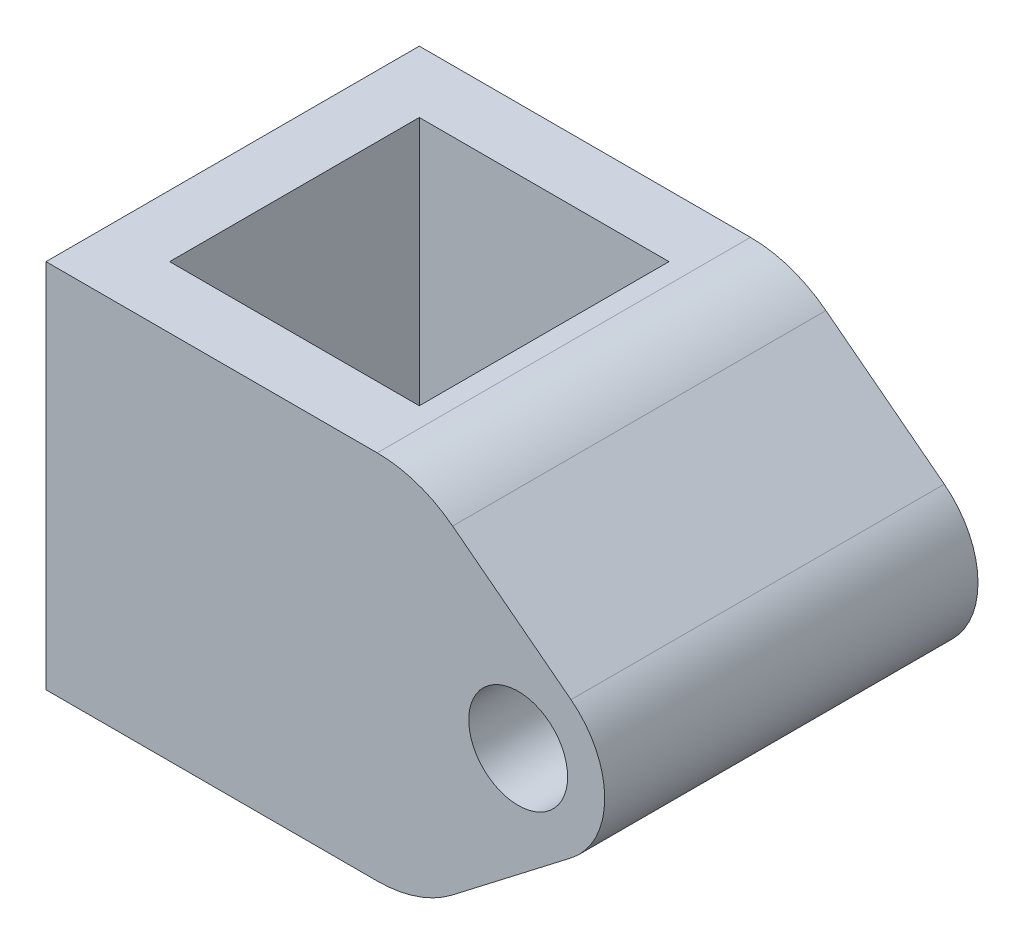
ISO-10303-21;
HEADER;
FILE_DESCRIPTION(('STEP AP214'),'2;1');
FILE_NAME('part.step','',(''),(''),'','','');
FILE_SCHEMA(('AUTOMOTIVE_DESIGN { 1 0 10303 214 1 1 1 1 }'));
ENDSEC;
DATA;
#1=APPLICATION_CONTEXT('core data for automotive mechanical design processes');
#2=APPLICATION_PROTOCOL_DEFINITION('international standard','automotive_design',2000,#1);
#3=PRODUCT_CONTEXT('',#1,'mechanical');
#4=PRODUCT('Part','Part','',(#3));
#5=PRODUCT_RELATED_PRODUCT_CATEGORY('part','',(#4));
#6=PRODUCT_DEFINITION_FORMATION('','',#4);
#7=PRODUCT_DEFINITION_CONTEXT('part definition',#1,'design');
#8=PRODUCT_DEFINITION('design','',#6,#7);
#9=PRODUCT_DEFINITION_SHAPE('','',#8);
#10=(LENGTH_UNIT() NAMED_UNIT(*) SI_UNIT(.MILLI.,.METRE.));
#11=(NAMED_UNIT(*) PLANE_ANGLE_UNIT() SI_UNIT($,.RADIAN.));
#12=(NAMED_UNIT(*) SI_UNIT($,.STERADIAN.) SOLID_ANGLE_UNIT());
#13=UNCERTAINTY_MEASURE_WITH_UNIT(LENGTH_MEASURE(1.E-05),#10,'distance_accuracy_value','');
#14=(GEOMETRIC_REPRESENTATION_CONTEXT(3) GLOBAL_UNCERTAINTY_ASSIGNED_CONTEXT((#13)) GLOBAL_UNIT_ASSIGNED_CONTEXT((#10,
#11,#12)) REPRESENTATION_CONTEXT('',''));
#15=CARTESIAN_POINT('',(0.,0.,0.));
#16=DIRECTION('',(0.,0.,1.));
#17=DIRECTION('',(1.,0.,0.));
#18=AXIS2_PLACEMENT_3D('',#15,#16,#17);
#19=CARTESIAN_POINT('',(0.,30.,0.));
#20=DIRECTION('',(0.,1.,0.));
#21=DIRECTION('',(0.,0.,1.));
#22=AXIS2_PLACEMENT_3D('',#19,#20,#21);
#23=PLANE('',#22);
#24=DIRECTION('',(1.,0.,0.));
#25=VECTOR('',#24,1.);
#26=CARTESIAN_POINT('',(0.,30.,5.));
#27=LINE('',#26,#25);
#28=CARTESIAN_POINT('',(-5.,30.,5.));
#29=VERTEX_POINT('',#28);
#30=CARTESIAN_POINT('',(21.7945757341683,30.,5.));
#31=VERTEX_POINT('',#30);
#32=EDGE_CURVE('E251',#29,#31,#27,.T.);
#33=ORIENTED_EDGE('',*,*,#32,.T.);
#34=DIRECTION('',(0.,0.,-1.));
#35=VECTOR('',#34,1.);
#36=CARTESIAN_POINT('',(21.7945757341683,30.,-25.2));
#37=LINE('',#36,#35);
#38=CARTESIAN_POINT('',(21.7945757341683,30.,-25.2));
#39=VERTEX_POINT('',#38);
#40=EDGE_CURVE('E78',#31,#39,#37,.T.);
#41=ORIENTED_EDGE('',*,*,#40,.T.);
#42=DIRECTION('',(-1.,0.,0.));
#43=VECTOR('',#42,1.);
#44=CARTESIAN_POINT('',(0.,30.,-25.2));
#45=LINE('',#44,#43);
#46=CARTESIAN_POINT('',(-5.,30.,-25.2));
#47=VERTEX_POINT('',#46);
#48=EDGE_CURVE('E255',#39,#47,#45,.T.);
#49=ORIENTED_EDGE('',*,*,#48,.T.);
#50=DIRECTION('',(0.,0.,1.));
#51=VECTOR('',#50,1.);
#52=CARTESIAN_POINT('',(-5.,30.,0.));
#53=LINE('',#52,#51);
#54=EDGE_CURVE('E247',#47,#29,#53,.T.);
#55=ORIENTED_EDGE('',*,*,#54,.T.);
#56=EDGE_LOOP('',(#33,#41,#49,#55));
#57=FACE_BOUND('',#56,.T.);
#58=DIRECTION('',(1.,0.,0.));
#59=VECTOR('',#58,1.);
#60=CARTESIAN_POINT('',(0.,30.,0.));
#61=LINE('',#60,#59);
#62=CARTESIAN_POINT('',(0.,30.,0.));
#63=VERTEX_POINT('',#62);
#64=CARTESIAN_POINT('',(20.2,30.,0.));
#65=VERTEX_POINT('',#64);
#66=EDGE_CURVE('E207',#63,#65,#61,.T.);
#67=ORIENTED_EDGE('',*,*,#66,.F.);
#68=DIRECTION('',(0.,0.,1.));
#69=VECTOR('',#68,1.);
#70=CARTESIAN_POINT('',(0.,30.,0.));
#71=LINE('',#70,#69);
#72=CARTESIAN_POINT('',(0.,30.,-20.2));
#73=VERTEX_POINT('',#72);
#74=EDGE_CURVE('E204',#73,#63,#71,.T.);
#75=ORIENTED_EDGE('',*,*,#74,.F.);
#76=DIRECTION('',(-1.,0.,0.));
#77=VECTOR('',#76,1.);
#78=CARTESIAN_POINT('',(0.,30.,-20.2));
#79=LINE('',#78,#77);
#80=CARTESIAN_POINT('',(20.2,30.,-20.2));
#81=VERTEX_POINT('',#80);
#82=EDGE_CURVE('E215',#81,#73,#79,.T.);
#83=ORIENTED_EDGE('',*,*,#82,.F.);
#84=DIRECTION('',(0.,0.,-1.));
#85=VECTOR('',#84,1.);
#86=CARTESIAN_POINT('',(20.2,30.,0.));
#87=LINE('',#86,#85);
#88=EDGE_CURVE('E211',#65,#81,#87,.T.);
#89=ORIENTED_EDGE('',*,*,#88,.F.);
#90=EDGE_LOOP('',(#67,#75,#83,#89));
#91=FACE_BOUND('',#90,.T.);
#92=ADVANCED_FACE('F69',(#57,#91),#23,.T.);
#93=CARTESIAN_POINT('',(0.,0.,0.));
#94=DIRECTION('',(0.,1.,0.));
#95=DIRECTION('',(0.,0.,1.));
#96=AXIS2_PLACEMENT_3D('',#93,#94,#95);
#97=PLANE('',#96);
#98=DIRECTION('',(-1.,0.,0.));
#99=VECTOR('',#98,1.);
#100=CARTESIAN_POINT('',(0.,0.,-25.2));
#101=LINE('',#100,#99);
#102=CARTESIAN_POINT('',(21.7945757341683,0.,-25.2));
#103=VERTEX_POINT('',#102);
#104=CARTESIAN_POINT('',(-5.,0.,-25.2));
#105=VERTEX_POINT('',#104);
#106=EDGE_CURVE('E252',#103,#105,#101,.T.);
#107=ORIENTED_EDGE('',*,*,#106,.F.);
#108=DIRECTION('',(0.,0.,-1.));
#109=VECTOR('',#108,1.);
#110=CARTESIAN_POINT('',(21.7945757341683,0.,0.));
#111=LINE('',#110,#109);
#112=CARTESIAN_POINT('',(21.7945757341683,0.,5.));
#113=VERTEX_POINT('',#112);
#114=EDGE_CURVE('E283',#103,#113,#111,.F.);
#115=ORIENTED_EDGE('',*,*,#114,.T.);
#116=DIRECTION('',(1.,0.,0.));
#117=VECTOR('',#116,1.);
#118=CARTESIAN_POINT('',(0.,0.,5.));
#119=LINE('',#118,#117);
#120=CARTESIAN_POINT('',(-5.,0.,5.));
#121=VERTEX_POINT('',#120);
#122=EDGE_CURVE('E262',#121,#113,#119,.T.);
#123=ORIENTED_EDGE('',*,*,#122,.F.);
#124=DIRECTION('',(0.,0.,1.));
#125=VECTOR('',#124,1.);
#126=CARTESIAN_POINT('',(-5.,0.,0.));
#127=LINE('',#126,#125);
#128=EDGE_CURVE('E246',#105,#121,#127,.T.);
#129=ORIENTED_EDGE('',*,*,#128,.F.);
#130=EDGE_LOOP('',(#107,#115,#123,#129));
#131=FACE_BOUND('',#130,.T.);
#132=DIRECTION('',(0.,0.,1.));
#133=VECTOR('',#132,1.);
#134=CARTESIAN_POINT('',(0.,0.,0.));
#135=LINE('',#134,#133);
#136=CARTESIAN_POINT('',(0.,0.,-20.2));
#137=VERTEX_POINT('',#136);
#138=CARTESIAN_POINT('',(0.,0.,0.));
#139=VERTEX_POINT('',#138);
#140=EDGE_CURVE('E202',#137,#139,#135,.T.);
#141=ORIENTED_EDGE('',*,*,#140,.T.);
#142=DIRECTION('',(1.,0.,0.));
#143=VECTOR('',#142,1.);
#144=CARTESIAN_POINT('',(0.,0.,0.));
#145=LINE('',#144,#143);
#146=CARTESIAN_POINT('',(20.2,0.,0.));
#147=VERTEX_POINT('',#146);
#148=EDGE_CURVE('E222',#139,#147,#145,.T.);
#149=ORIENTED_EDGE('',*,*,#148,.T.);
#150=DIRECTION('',(0.,0.,-1.));
#151=VECTOR('',#150,1.);
#152=CARTESIAN_POINT('',(20.2,0.,0.));
#153=LINE('',#152,#151);
#154=CARTESIAN_POINT('',(20.2,0.,-20.2));
#155=VERTEX_POINT('',#154);
#156=EDGE_CURVE('E226',#147,#155,#153,.T.);
#157=ORIENTED_EDGE('',*,*,#156,.T.);
#158=DIRECTION('',(-1.,0.,0.));
#159=VECTOR('',#158,1.);
#160=CARTESIAN_POINT('',(0.,0.,-20.2));
#161=LINE('',#160,#159);
#162=EDGE_CURVE('E208',#155,#137,#161,.T.);
#163=ORIENTED_EDGE('',*,*,#162,.T.);
#164=EDGE_LOOP('',(#141,#149,#157,#163));
#165=FACE_BOUND('',#164,.T.);
#166=ADVANCED_FACE('F323',(#131,#165),#97,.F.);
#167=CARTESIAN_POINT('',(-5.,30.,0.));
#168=DIRECTION('',(1.,0.,0.));
#169=DIRECTION('',(0.,0.,-1.));
#170=AXIS2_PLACEMENT_3D('',#167,#168,#169);
#171=PLANE('',#170);
#172=ORIENTED_EDGE('',*,*,#128,.T.);
#173=DIRECTION('',(0.,-1.,0.));
#174=VECTOR('',#173,1.);
#175=CARTESIAN_POINT('',(-5.,30.,5.));
#176=LINE('',#175,#174);
#177=EDGE_CURVE('E270',#29,#121,#176,.T.);
#178=ORIENTED_EDGE('',*,*,#177,.F.);
#179=ORIENTED_EDGE('',*,*,#54,.F.);
#180=DIRECTION('',(0.,-1.,0.));
#181=VECTOR('',#180,1.);
#182=CARTESIAN_POINT('',(-5.,30.,-25.2));
#183=LINE('',#182,#181);
#184=EDGE_CURVE('E258',#47,#105,#183,.T.);
#185=ORIENTED_EDGE('',*,*,#184,.T.);
#186=EDGE_LOOP('',(#172,#178,#179,#185));
#187=FACE_BOUND('',#186,.T.);
#188=ADVANCED_FACE('F305',(#187),#171,.F.);
#189=CARTESIAN_POINT('',(0.,30.,5.));
#190=DIRECTION('',(0.,0.,-1.));
#191=DIRECTION('',(-1.,0.,0.));
#192=AXIS2_PLACEMENT_3D('',#189,#190,#191);
#193=PLANE('',#192);
#194=ORIENTED_EDGE('',*,*,#122,.T.);
#195=CARTESIAN_POINT('',(21.7945757341683,10.,5.));
#196=DIRECTION('',(0.,0.,-1.));
#197=DIRECTION('',(-1.,0.,0.));
#198=AXIS2_PLACEMENT_3D('',#195,#196,#197);
#199=CIRCLE('',#198,10.);
#200=CARTESIAN_POINT('',(27.8976553456716,2.07835754053158,5.));
#201=VERTEX_POINT('',#200);
#202=EDGE_CURVE('E180',#113,#201,#199,.F.);
#203=ORIENTED_EDGE('',*,*,#202,.T.);
#204=DIRECTION('',(-0.792164245946842,-0.610307961150329,0.));
#205=VECTOR('',#204,1.);
#206=CARTESIAN_POINT('',(9.38639034757547,-12.1832964751681,5.));
#207=LINE('',#206,#205);
#208=CARTESIAN_POINT('',(37.4721557280523,9.45485027837212,5.));
#209=VERTEX_POINT('',#208);
#210=EDGE_CURVE('E162',#209,#201,#207,.T.);
#211=ORIENTED_EDGE('',*,*,#210,.F.);
#212=CARTESIAN_POINT('',(33.2,15.,5.));
#213=DIRECTION('',(0.,0.,1.));
#214=DIRECTION('',(1.,0.,0.));
#215=AXIS2_PLACEMENT_3D('',#212,#213,#214);
#216=CIRCLE('',#215,7.);
#217=CARTESIAN_POINT('',(37.4721557280523,20.5451497216279,5.));
#218=VERTEX_POINT('',#217);
#219=EDGE_CURVE('E178',#209,#218,#216,.T.);
#220=ORIENTED_EDGE('',*,*,#219,.T.);
#221=DIRECTION('',(0.792164245946843,-0.610307961150328,0.));
#222=VECTOR('',#221,1.);
#223=CARTESIAN_POINT('',(23.8903147227756,31.009022251864,5.));
#224=LINE('',#223,#222);
#225=CARTESIAN_POINT('',(27.8976553456716,27.9216424594684,5.));
#226=VERTEX_POINT('',#225);
#227=EDGE_CURVE('E187',#226,#218,#224,.T.);
#228=ORIENTED_EDGE('',*,*,#227,.F.);
#229=CARTESIAN_POINT('',(21.7945757341683,20.,5.));
#230=DIRECTION('',(0.,0.,-1.));
#231=DIRECTION('',(-1.,0.,0.));
#232=AXIS2_PLACEMENT_3D('',#229,#230,#231);
#233=CIRCLE('',#232,10.);
#234=EDGE_CURVE('E85',#226,#31,#233,.F.);
#235=ORIENTED_EDGE('',*,*,#234,.T.);
#236=ORIENTED_EDGE('',*,*,#32,.F.);
#237=ORIENTED_EDGE('',*,*,#177,.T.);
#238=EDGE_LOOP('',(#194,#203,#211,#220,#228,#235,#236,#237));
#239=FACE_BOUND('',#238,.T.);
#240=CARTESIAN_POINT('',(33.2,15.,5.));
#241=DIRECTION('',(0.,0.,1.));
#242=DIRECTION('',(1.,0.,0.));
#243=AXIS2_PLACEMENT_3D('',#240,#241,#242);
#244=CIRCLE('',#243,4.00000000000001);
#245=CARTESIAN_POINT('',(37.2,15.,5.));
#246=VERTEX_POINT('',#245);
#247=EDGE_CURVE('E172',#246,#246,#244,.T.);
#248=ORIENTED_EDGE('',*,*,#247,.F.);
#249=EDGE_LOOP('',(#248));
#250=FACE_BOUND('',#249,.T.);
#251=ADVANCED_FACE('F176',(#239,#250),#193,.F.);
#252=CARTESIAN_POINT('',(0.,30.,-25.2));
#253=DIRECTION('',(0.,0.,1.));
#254=DIRECTION('',(1.,0.,0.));
#255=AXIS2_PLACEMENT_3D('',#252,#253,#254);
#256=PLANE('',#255);
#257=DIRECTION('',(0.792164245946842,0.610307961150329,0.));
#258=VECTOR('',#257,1.);
#259=CARTESIAN_POINT('',(9.38639034757547,-12.1832964751681,-25.2));
#260=LINE('',#259,#258);
#261=CARTESIAN_POINT('',(27.8976553456716,2.07835754053158,-25.2));
#262=VERTEX_POINT('',#261);
#263=CARTESIAN_POINT('',(37.4721557280523,9.45485027837212,-25.2));
#264=VERTEX_POINT('',#263);
#265=EDGE_CURVE('E165',#262,#264,#260,.T.);
#266=ORIENTED_EDGE('',*,*,#265,.F.);
#267=CARTESIAN_POINT('',(21.7945757341683,10.,-25.2));
#268=DIRECTION('',(0.,0.,1.));
#269=DIRECTION('',(1.,0.,0.));
#270=AXIS2_PLACEMENT_3D('',#267,#268,#269);
#271=CIRCLE('',#270,10.);
#272=EDGE_CURVE('E280',#262,#103,#271,.F.);
#273=ORIENTED_EDGE('',*,*,#272,.T.);
#274=ORIENTED_EDGE('',*,*,#106,.T.);
#275=ORIENTED_EDGE('',*,*,#184,.F.);
#276=ORIENTED_EDGE('',*,*,#48,.F.);
#277=CARTESIAN_POINT('',(21.7945757341683,20.,-25.2));
#278=DIRECTION('',(0.,0.,1.));
#279=DIRECTION('',(1.,0.,0.));
#280=AXIS2_PLACEMENT_3D('',#277,#278,#279);
#281=CIRCLE('',#280,10.);
#282=CARTESIAN_POINT('',(27.8976553456716,27.9216424594684,-25.2));
#283=VERTEX_POINT('',#282);
#284=EDGE_CURVE('E277',#39,#283,#281,.F.);
#285=ORIENTED_EDGE('',*,*,#284,.T.);
#286=DIRECTION('',(-0.792164245946843,0.610307961150328,0.));
#287=VECTOR('',#286,1.);
#288=CARTESIAN_POINT('',(23.8903147227756,31.009022251864,-25.2));
#289=LINE('',#288,#287);
#290=CARTESIAN_POINT('',(37.4721557280523,20.5451497216279,-25.2));
#291=VERTEX_POINT('',#290);
#292=EDGE_CURVE('E203',#291,#283,#289,.T.);
#293=ORIENTED_EDGE('',*,*,#292,.F.);
#294=CARTESIAN_POINT('',(33.2,15.,-25.2));
#295=DIRECTION('',(0.,0.,1.));
#296=DIRECTION('',(1.,0.,0.));
#297=AXIS2_PLACEMENT_3D('',#294,#295,#296);
#298=CIRCLE('',#297,7.);
#299=EDGE_CURVE('E310',#291,#264,#298,.F.);
#300=ORIENTED_EDGE('',*,*,#299,.T.);
#301=EDGE_LOOP('',(#266,#273,#274,#275,#276,#285,#293,#300));
#302=FACE_BOUND('',#301,.T.);
#303=CARTESIAN_POINT('',(33.2,15.,-25.2));
#304=DIRECTION('',(0.,0.,1.));
#305=DIRECTION('',(1.,0.,0.));
#306=AXIS2_PLACEMENT_3D('',#303,#304,#305);
#307=CIRCLE('',#306,4.00000000000001);
#308=CARTESIAN_POINT('',(37.2,15.,-25.2));
#309=VERTEX_POINT('',#308);
#310=EDGE_CURVE('E198',#309,#309,#307,.F.);
#311=ORIENTED_EDGE('',*,*,#310,.F.);
#312=EDGE_LOOP('',(#311));
#313=FACE_BOUND('',#312,.T.);
#314=ADVANCED_FACE('F298',(#302,#313),#256,.F.);
#315=CARTESIAN_POINT('',(0.,30.,0.));
#316=DIRECTION('',(1.,0.,0.));
#317=DIRECTION('',(0.,0.,-1.));
#318=AXIS2_PLACEMENT_3D('',#315,#316,#317);
#319=PLANE('',#318);
#320=ORIENTED_EDGE('',*,*,#140,.F.);
#321=DIRECTION('',(0.,-1.,0.));
#322=VECTOR('',#321,1.);
#323=CARTESIAN_POINT('',(0.,30.,-20.2));
#324=LINE('',#323,#322);
#325=EDGE_CURVE('E218',#73,#137,#324,.T.);
#326=ORIENTED_EDGE('',*,*,#325,.F.);
#327=ORIENTED_EDGE('',*,*,#74,.T.);
#328=DIRECTION('',(0.,-1.,0.));
#329=VECTOR('',#328,1.);
#330=CARTESIAN_POINT('',(0.,30.,0.));
#331=LINE('',#330,#329);
#332=EDGE_CURVE('E242',#63,#139,#331,.T.);
#333=ORIENTED_EDGE('',*,*,#332,.T.);
#334=EDGE_LOOP('',(#320,#326,#327,#333));
#335=FACE_BOUND('',#334,.T.);
#336=ADVANCED_FACE('F331',(#335),#319,.T.);
#337=CARTESIAN_POINT('',(0.,30.,0.));
#338=DIRECTION('',(0.,0.,-1.));
#339=DIRECTION('',(-1.,0.,0.));
#340=AXIS2_PLACEMENT_3D('',#337,#338,#339);
#341=PLANE('',#340);
#342=ORIENTED_EDGE('',*,*,#148,.F.);
#343=ORIENTED_EDGE('',*,*,#332,.F.);
#344=ORIENTED_EDGE('',*,*,#66,.T.);
#345=DIRECTION('',(0.,-1.,0.));
#346=VECTOR('',#345,1.);
#347=CARTESIAN_POINT('',(20.2,30.,0.));
#348=LINE('',#347,#346);
#349=EDGE_CURVE('E239',#65,#147,#348,.T.);
#350=ORIENTED_EDGE('',*,*,#349,.T.);
#351=EDGE_LOOP('',(#342,#343,#344,#350));
#352=FACE_BOUND('',#351,.T.);
#353=ADVANCED_FACE('F350',(#352),#341,.T.);
#354=CARTESIAN_POINT('',(20.2,30.,0.));
#355=DIRECTION('',(-1.,0.,0.));
#356=DIRECTION('',(0.,0.,1.));
#357=AXIS2_PLACEMENT_3D('',#354,#355,#356);
#358=PLANE('',#357);
#359=ORIENTED_EDGE('',*,*,#156,.F.);
#360=ORIENTED_EDGE('',*,*,#349,.F.);
#361=ORIENTED_EDGE('',*,*,#88,.T.);
#362=DIRECTION('',(0.,-1.,0.));
#363=VECTOR('',#362,1.);
#364=CARTESIAN_POINT('',(20.2,30.,-20.2));
#365=LINE('',#364,#363);
#366=EDGE_CURVE('E236',#81,#155,#365,.T.);
#367=ORIENTED_EDGE('',*,*,#366,.T.);
#368=EDGE_LOOP('',(#359,#360,#361,#367));
#369=FACE_BOUND('',#368,.T.);
#370=ADVANCED_FACE('F359',(#369),#358,.T.);
#371=CARTESIAN_POINT('',(0.,30.,-20.2));
#372=DIRECTION('',(0.,0.,1.));
#373=DIRECTION('',(1.,0.,0.));
#374=AXIS2_PLACEMENT_3D('',#371,#372,#373);
#375=PLANE('',#374);
#376=ORIENTED_EDGE('',*,*,#162,.F.);
#377=ORIENTED_EDGE('',*,*,#366,.F.);
#378=ORIENTED_EDGE('',*,*,#82,.T.);
#379=ORIENTED_EDGE('',*,*,#325,.T.);
#380=EDGE_LOOP('',(#376,#377,#378,#379));
#381=FACE_BOUND('',#380,.T.);
#382=ADVANCED_FACE('F367',(#381),#375,.T.);
#383=CARTESIAN_POINT('',(9.38639034757547,-12.1832964751681,-58.7410196624968));
#384=DIRECTION('',(-0.610307961150329,0.792164245946842,0.));
#385=DIRECTION('',(-0.792164245946842,-0.610307961150329,0.));
#386=AXIS2_PLACEMENT_3D('',#383,#384,#385);
#387=PLANE('',#386);
#388=ORIENTED_EDGE('',*,*,#210,.T.);
#389=DIRECTION('',(0.,0.,-1.));
#390=VECTOR('',#389,1.);
#391=CARTESIAN_POINT('',(27.8976553456716,2.07835754053158,-58.7410196624968));
#392=LINE('',#391,#390);
#393=EDGE_CURVE('E274',#201,#262,#392,.T.);
#394=ORIENTED_EDGE('',*,*,#393,.T.);
#395=ORIENTED_EDGE('',*,*,#265,.T.);
#396=DIRECTION('',(0.,0.,1.));
#397=VECTOR('',#396,1.);
#398=CARTESIAN_POINT('',(37.4721557280523,9.45485027837212,-58.7410196624968));
#399=LINE('',#398,#397);
#400=EDGE_CURVE('E158',#264,#209,#399,.T.);
#401=ORIENTED_EDGE('',*,*,#400,.T.);
#402=EDGE_LOOP('',(#388,#394,#395,#401));
#403=FACE_BOUND('',#402,.T.);
#404=ADVANCED_FACE('F160',(#403),#387,.F.);
#405=CARTESIAN_POINT('',(33.2,15.,-58.7410196624968));
#406=DIRECTION('',(0.,0.,1.));
#407=DIRECTION('',(1.,0.,0.));
#408=AXIS2_PLACEMENT_3D('',#405,#406,#407);
#409=CYLINDRICAL_SURFACE('',#408,7.);
#410=ORIENTED_EDGE('',*,*,#299,.F.);
#411=DIRECTION('',(0.,0.,1.));
#412=VECTOR('',#411,1.);
#413=CARTESIAN_POINT('',(37.4721557280523,20.5451497216279,-58.7410196624968));
#414=LINE('',#413,#412);
#415=EDGE_CURVE('E171',#291,#218,#414,.T.);
#416=ORIENTED_EDGE('',*,*,#415,.T.);
#417=ORIENTED_EDGE('',*,*,#219,.F.);
#418=ORIENTED_EDGE('',*,*,#400,.F.);
#419=EDGE_LOOP('',(#410,#416,#417,#418));
#420=FACE_BOUND('',#419,.T.);
#421=ADVANCED_FACE('F184',(#420),#409,.T.);
#422=CARTESIAN_POINT('',(23.8903147227756,31.009022251864,-58.7410196624968));
#423=DIRECTION('',(-0.610307961150328,-0.792164245946843,0.));
#424=DIRECTION('',(0.792164245946843,-0.610307961150328,0.));
#425=AXIS2_PLACEMENT_3D('',#422,#423,#424);
#426=PLANE('',#425);
#427=ORIENTED_EDGE('',*,*,#292,.T.);
#428=DIRECTION('',(0.,0.,-1.));
#429=VECTOR('',#428,1.);
#430=CARTESIAN_POINT('',(27.8976553456716,27.9216424594684,5.));
#431=LINE('',#430,#429);
#432=EDGE_CURVE('E12',#283,#226,#431,.F.);
#433=ORIENTED_EDGE('',*,*,#432,.T.);
#434=ORIENTED_EDGE('',*,*,#227,.T.);
#435=ORIENTED_EDGE('',*,*,#415,.F.);
#436=EDGE_LOOP('',(#427,#433,#434,#435));
#437=FACE_BOUND('',#436,.T.);
#438=ADVANCED_FACE('F316',(#437),#426,.F.);
#439=CARTESIAN_POINT('',(33.2,15.,-58.7410196624968));
#440=DIRECTION('',(0.,0.,1.));
#441=DIRECTION('',(1.,0.,0.));
#442=AXIS2_PLACEMENT_3D('',#439,#440,#441);
#443=CYLINDRICAL_SURFACE('',#442,4.00000000000001);
#444=ORIENTED_EDGE('',*,*,#310,.T.);
#445=EDGE_LOOP('',(#444));
#446=FACE_BOUND('',#445,.T.);
#447=ORIENTED_EDGE('',*,*,#247,.T.);
#448=EDGE_LOOP('',(#447));
#449=FACE_BOUND('',#448,.T.);
#450=ADVANCED_FACE('F321',(#446,#449),#443,.F.);
#451=CARTESIAN_POINT('',(21.7945757341683,10.,-58.7410196624968));
#452=DIRECTION('',(0.,0.,-1.));
#453=DIRECTION('',(-1.,0.,0.));
#454=AXIS2_PLACEMENT_3D('',#451,#452,#453);
#455=CYLINDRICAL_SURFACE('',#454,10.);
#456=ORIENTED_EDGE('',*,*,#202,.F.);
#457=ORIENTED_EDGE('',*,*,#114,.F.);
#458=ORIENTED_EDGE('',*,*,#272,.F.);
#459=ORIENTED_EDGE('',*,*,#393,.F.);
#460=EDGE_LOOP('',(#456,#457,#458,#459));
#461=FACE_BOUND('',#460,.T.);
#462=ADVANCED_FACE('F309',(#461),#455,.T.);
#463=CARTESIAN_POINT('',(21.7945757341683,20.,0.));
#464=DIRECTION('',(0.,0.,1.));
#465=DIRECTION('',(1.,0.,0.));
#466=AXIS2_PLACEMENT_3D('',#463,#464,#465);
#467=CYLINDRICAL_SURFACE('',#466,10.);
#468=ORIENTED_EDGE('',*,*,#234,.F.);
#469=ORIENTED_EDGE('',*,*,#432,.F.);
#470=ORIENTED_EDGE('',*,*,#284,.F.);
#471=ORIENTED_EDGE('',*,*,#40,.F.);
#472=EDGE_LOOP('',(#468,#469,#470,#471));
#473=FACE_BOUND('',#472,.T.);
#474=ADVANCED_FACE('F71',(#473),#467,.T.);
#475=CLOSED_SHELL('',(#92,#166,#188,#251,#314,#336,#353,#370,#382,#404,#421,#438,#450,#462,#474));
#476=MANIFOLD_SOLID_BREP('B2',#475);
#477=ADVANCED_BREP_SHAPE_REPRESENTATION('',(#18,#476),#14);
#478=SHAPE_DEFINITION_REPRESENTATION(#9,#477);
ENDSEC;
END-ISO-10303-21;
